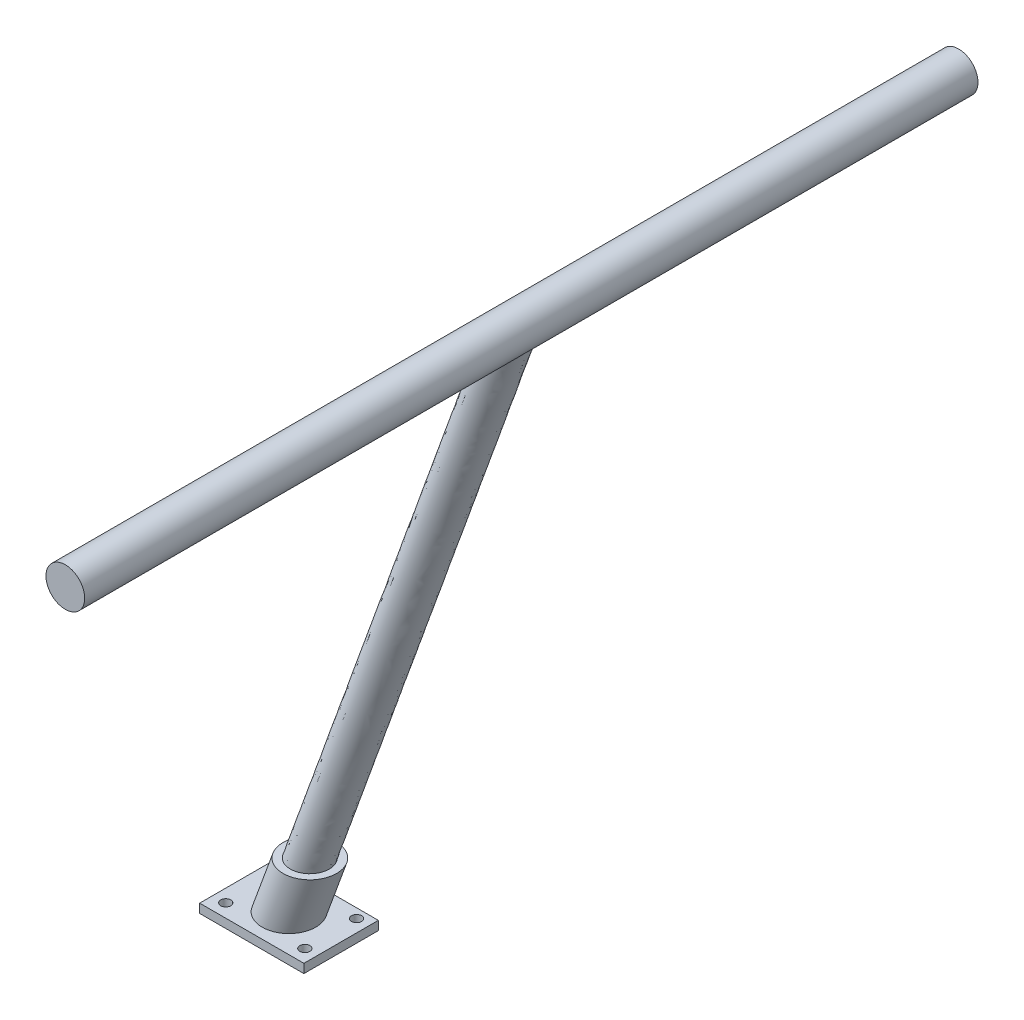
ISO-10303-21;
HEADER;
FILE_DESCRIPTION(('STEP AP214'),'2;1');
FILE_NAME('part.step','',(''),(''),'','','');
FILE_SCHEMA(('AUTOMOTIVE_DESIGN { 1 0 10303 214 1 1 1 1 }'));
ENDSEC;
DATA;
#1=APPLICATION_CONTEXT('core data for automotive mechanical design processes');
#2=APPLICATION_PROTOCOL_DEFINITION('international standard','automotive_design',2000,#1);
#3=PRODUCT_CONTEXT('',#1,'mechanical');
#4=PRODUCT('Part','Part','',(#3));
#5=PRODUCT_RELATED_PRODUCT_CATEGORY('part','',(#4));
#6=PRODUCT_DEFINITION_FORMATION('','',#4);
#7=PRODUCT_DEFINITION_CONTEXT('part definition',#1,'design');
#8=PRODUCT_DEFINITION('design','',#6,#7);
#9=PRODUCT_DEFINITION_SHAPE('','',#8);
#10=(LENGTH_UNIT() NAMED_UNIT(*) SI_UNIT(.MILLI.,.METRE.));
#11=(NAMED_UNIT(*) PLANE_ANGLE_UNIT() SI_UNIT($,.RADIAN.));
#12=(NAMED_UNIT(*) SI_UNIT($,.STERADIAN.) SOLID_ANGLE_UNIT());
#13=UNCERTAINTY_MEASURE_WITH_UNIT(LENGTH_MEASURE(1.E-05),#10,'distance_accuracy_value','');
#14=(GEOMETRIC_REPRESENTATION_CONTEXT(3) GLOBAL_UNCERTAINTY_ASSIGNED_CONTEXT((#13)) GLOBAL_UNIT_ASSIGNED_CONTEXT((#10,
#11,#12)) REPRESENTATION_CONTEXT('',''));
#15=CARTESIAN_POINT('',(0.,0.,0.));
#16=DIRECTION('',(0.,0.,1.));
#17=DIRECTION('',(1.,0.,0.));
#18=AXIS2_PLACEMENT_3D('',#15,#16,#17);
#19=CARTESIAN_POINT('',(0.,3.,6.5));
#20=CARTESIAN_POINT('',(74.8823198165988,209.863815537867,6.5));
#21=CARTESIAN_POINT('',(13.,3.,6.5));
#22=CARTESIAN_POINT('',(87.8823198165988,209.863815537867,6.5));
#23=CARTESIAN_POINT('',(13.,3.,-6.5));
#24=CARTESIAN_POINT('',(87.8823198165988,209.863815537867,-6.5));
#25=CARTESIAN_POINT('',(0.,3.,-6.5));
#26=CARTESIAN_POINT('',(74.8823198165988,209.863815537867,-6.5));
#27=CARTESIAN_POINT('',(-13.,3.,-6.5));
#28=CARTESIAN_POINT('',(61.8823198165988,209.863815537867,-6.5));
#29=CARTESIAN_POINT('',(-13.,3.,6.5));
#30=CARTESIAN_POINT('',(61.8823198165988,209.863815537867,6.5));
#31=CARTESIAN_POINT('',(0.,3.,6.5));
#32=CARTESIAN_POINT('',(74.8823198165988,209.863815537867,6.5));
#33=(BOUNDED_SURFACE() B_SPLINE_SURFACE(3,1,((#19,#20),(#21,#22),(#23,#24),(#25,#26),(#27,#28),
(#29,#30),(#31,#32)),.UNSPECIFIED.,.T.,.F.,.F.) B_SPLINE_SURFACE_WITH_KNOTS((4,3,4),(2,2),(0.,
0.5,1.),(0.,1.),.UNSPECIFIED.) GEOMETRIC_REPRESENTATION_ITEM() RATIONAL_B_SPLINE_SURFACE(((1.,
1.),(0.333333333333333,0.333333333333333),(0.333333333333333,0.333333333333333),(1.,1.),
(0.333333333333333,0.333333333333333),(0.333333333333333,0.333333333333333),(1.,1.))) REPRESENTATION_ITEM('') SURFACE());
#34=CARTESIAN_POINT('',(6.92789586589603,22.1384425052306,6.5));
#35=CARTESIAN_POINT('',(7.10787302393273,22.1384425052306,6.49999806037431));
#36=CARTESIAN_POINT('',(7.28789944726932,22.1384425052306,6.49251775741276));
#37=CARTESIAN_POINT('',(7.64691865661481,22.1384425052306,6.46262416322299));
#38=CARTESIAN_POINT('',(7.82590978129139,22.1384425052306,6.440191339223));
#39=CARTESIAN_POINT('',(8.18373503105978,22.1384425052306,6.38014103722446));
#40=CARTESIAN_POINT('',(8.36253670485913,22.1384425052306,6.34232946245636));
#41=CARTESIAN_POINT('',(8.71638869629833,22.1384425052306,6.25177270310041));
#42=CARTESIAN_POINT('',(8.89143753561501,22.1384425052306,6.19902174575223));
#43=CARTESIAN_POINT('',(9.23662283439896,22.1384425052306,6.07891459175732));
#44=CARTESIAN_POINT('',(9.40675487562154,22.1384425052306,6.01154569515505));
#45=CARTESIAN_POINT('',(9.74079763468615,22.1384425052306,5.86268134780492));
#46=CARTESIAN_POINT('',(9.90470602302412,22.1384425052306,5.78118066986687));
#47=CARTESIAN_POINT('',(10.2249307539887,22.1384425052306,5.60472589803703));
#48=CARTESIAN_POINT('',(10.3812534693084,22.1384425052306,5.50978336883973));
#49=CARTESIAN_POINT('',(10.6854016623214,22.1384425052306,5.30702988800258));
#50=CARTESIAN_POINT('',(10.83322398341,22.1384425052306,5.19921420108145));
#51=CARTESIAN_POINT('',(11.1191645222382,22.1384425052306,4.97158324531647));
#52=CARTESIAN_POINT('',(11.2572889610266,22.1384425052306,4.85177579091581));
#53=CARTESIAN_POINT('',(11.5230066845809,22.1384425052306,4.6009079495255));
#54=CARTESIAN_POINT('',(11.6505960638696,22.1384425052306,4.46984342580904));
#55=CARTESIAN_POINT('',(11.894248400786,22.1384425052306,4.19746625724348));
#56=CARTESIAN_POINT('',(12.010314292436,22.1384425052306,4.05615623696095));
#57=CARTESIAN_POINT('',(12.2301725305776,22.1384425052306,3.76420870764892));
#58=CARTESIAN_POINT('',(12.3339603291228,22.1384425052306,3.61356777362553));
#59=CARTESIAN_POINT('',(12.5284435447691,22.1384425052306,3.30412614541804));
#60=CARTESIAN_POINT('',(12.619143114401,22.1384425052306,3.14532806104866));
#61=CARTESIAN_POINT('',(12.7868755640556,22.1384425052306,2.82059663551728));
#62=CARTESIAN_POINT('',(12.8639033856301,22.1384425052306,2.65466068148868));
#63=CARTESIAN_POINT('',(13.0036759041341,22.1384425052306,2.31695471668466));
#64=CARTESIAN_POINT('',(13.0664261840889,22.1384425052306,2.14518701662892));
#65=CARTESIAN_POINT('',(13.177256849986,22.1384425052306,1.79691256199059));
#66=CARTESIAN_POINT('',(13.2253318113881,22.1384425052306,1.62040408120579));
#67=CARTESIAN_POINT('',(13.3064229807721,22.1384425052306,1.26403009178918));
#68=CARTESIAN_POINT('',(13.3394448276958,22.1384425052306,1.08416586655533));
#69=CARTESIAN_POINT('',(13.3902323922716,22.1384425052306,0.722231776888186));
#70=CARTESIAN_POINT('',(13.407992472883,22.1384425052306,0.540161122653113));
#71=CARTESIAN_POINT('',(13.4281006067863,22.1384425052306,0.175224742477707));
#72=CARTESIAN_POINT('',(13.4304542951375,22.1384425052306,-0.00764066827970122));
#73=CARTESIAN_POINT('',(13.419765437547,22.1384425052306,-0.372939116940066));
#74=CARTESIAN_POINT('',(13.4067172069706,22.1384425052306,-0.55537197028394));
#75=CARTESIAN_POINT('',(13.34453838565,22.1384425052306,-1.09992879763092));
#76=CARTESIAN_POINT('',(13.2723951782202,22.1384425052306,-1.45970800716479));
#77=CARTESIAN_POINT('',(13.0687607446411,22.1384425052306,-2.16184980907283));
#78=CARTESIAN_POINT('',(12.9372695205312,22.1384425052306,-2.50421240204556));
#79=CARTESIAN_POINT('',(12.6186675373144,22.1384425052306,-3.16205615402645));
#80=CARTESIAN_POINT('',(12.4315567348838,22.1384425052306,-3.47753729209568));
#81=CARTESIAN_POINT('',(12.0070282909133,22.1384425052306,-4.07259423631814));
#82=CARTESIAN_POINT('',(11.7696106603194,22.1384425052306,-4.3521700502839));
#83=CARTESIAN_POINT('',(11.2512079259835,22.1384425052306,-4.86749820605125));
#84=CARTESIAN_POINT('',(10.9702228372179,22.1384425052306,-5.10325056291726));
#85=CARTESIAN_POINT('',(10.3726615093251,22.1384425052306,-5.52423475479281));
#86=CARTESIAN_POINT('',(10.056085266249,22.1384425052306,-5.70946658419713));
#87=CARTESIAN_POINT('',(9.39632826159159,22.1384425052306,-6.02415282638959));
#88=CARTESIAN_POINT('',(9.05314749676842,22.1384425052306,-6.15360723238105));
#89=CARTESIAN_POINT('',(8.34992339435535,22.1384425052306,-6.35306341035082));
#90=CARTESIAN_POINT('',(7.98988005734655,22.1384425052306,-6.42306518437785));
#91=CARTESIAN_POINT('',(7.26315138944631,22.1384425052306,-6.50162905490163));
#92=CARTESIAN_POINT('',(6.89646605890648,22.1384425052306,-6.51019115465071));
#93=CARTESIAN_POINT('',(6.16686250852888,22.1384425052306,-6.46563260082384));
#94=CARTESIAN_POINT('',(5.80394428864819,22.1384425052306,-6.41251194795062));
#95=CARTESIAN_POINT('',(5.09217710599249,22.1384425052306,-6.24609585447203));
#96=CARTESIAN_POINT('',(4.74332814428282,22.1384425052306,-6.13280040931017));
#97=CARTESIAN_POINT('',(4.06960229010161,22.1384425052306,-5.84925074794618));
#98=CARTESIAN_POINT('',(3.74472539933672,22.1384425052306,-5.678996527689));
#99=CARTESIAN_POINT('',(3.12816604666716,22.1384425052306,-5.28636272768447));
#100=CARTESIAN_POINT('',(2.83648357752264,22.1384425052306,-5.06398315930593));
#101=CARTESIAN_POINT('',(2.2945931815615,22.1384425052306,-4.57341009016808));
#102=CARTESIAN_POINT('',(2.04438524694055,22.1384425052306,-4.30521659802967));
#103=CARTESIAN_POINT('',(1.59254586538815,22.1384425052306,-3.73063355243368));
#104=CARTESIAN_POINT('',(1.390914447333,22.1384425052306,-3.42424397627062));
#105=CARTESIAN_POINT('',(1.04195389510686,22.1384425052306,-2.78194819292401));
#106=CARTESIAN_POINT('',(0.894624776722688,22.1384425052306,-2.4460419771594));
#107=CARTESIAN_POINT('',(0.658444096589992,22.1384425052306,-1.75431637273248));
#108=CARTESIAN_POINT('',(0.569592466078452,22.1384425052306,-1.39849700748635));
#109=CARTESIAN_POINT('',(0.452915532967883,22.1384425052306,-0.676793004683516));
#110=CARTESIAN_POINT('',(0.425090266003319,22.1384425052306,-0.310908361249619));
#111=CARTESIAN_POINT('',(0.429641076442871,22.1384425052306,0.237168006101527));
#112=CARTESIAN_POINT('',(0.438890202126675,22.1384425052306,0.419832815036486));
#113=CARTESIAN_POINT('',(0.472734198698052,22.1384425052306,0.783716997482473));
#114=CARTESIAN_POINT('',(0.497323404713403,22.1384425052306,0.964936879575524));
#115=CARTESIAN_POINT('',(0.561691272009632,22.1384425052306,1.32471309810583));
#116=CARTESIAN_POINT('',(0.601475413733635,22.1384425052306,1.50326844933952));
#117=CARTESIAN_POINT('',(0.695928881552405,22.1384425052306,1.85633048557793));
#118=CARTESIAN_POINT('',(0.750592708740308,22.1384425052306,2.03083864045323));
#119=CARTESIAN_POINT('',(0.87444830284147,22.1384425052306,2.3746961541715));
#120=CARTESIAN_POINT('',(0.943645662750788,22.1384425052306,2.54404349814605));
#121=CARTESIAN_POINT('',(1.09603505071561,22.1384425052306,2.87624435468357));
#122=CARTESIAN_POINT('',(1.17922190473826,22.1384425052306,3.03910024067404));
#123=CARTESIAN_POINT('',(1.35905467090869,22.1384425052306,3.35729332885904));
#124=CARTESIAN_POINT('',(1.45570620370471,22.1384425052306,3.51262735447385));
#125=CARTESIAN_POINT('',(1.66171629292924,22.1384425052306,3.81454305257729));
#126=CARTESIAN_POINT('',(1.77107014576472,22.1384425052306,3.96112793457554));
#127=CARTESIAN_POINT('',(2.00176567150413,22.1384425052306,4.24460177272211));
#128=CARTESIAN_POINT('',(2.12311038211381,22.1384425052306,4.3814882567673));
#129=CARTESIAN_POINT('',(2.37685451674287,22.1384425052306,4.64450223052314));
#130=CARTESIAN_POINT('',(2.5092498429251,22.1384425052306,4.77063367369683));
#131=CARTESIAN_POINT('',(2.78421169742256,22.1384425052306,5.01131407167941));
#132=CARTESIAN_POINT('',(2.92677959230627,22.1384425052306,5.12586146528815));
#133=CARTESIAN_POINT('',(3.22100302580611,22.1384425052306,5.34250017863424));
#134=CARTESIAN_POINT('',(3.37265519344747,22.1384425052306,5.44459607667323));
#135=CARTESIAN_POINT('',(3.68416630770629,22.1384425052306,5.63574705127996));
#136=CARTESIAN_POINT('',(3.84403294277952,22.1384425052306,5.7247895986494));
#137=CARTESIAN_POINT('',(4.17064178797332,22.1384425052306,5.88905352862092));
#138=CARTESIAN_POINT('',(4.33738143827622,22.1384425052306,5.96428000100252));
#139=CARTESIAN_POINT('',(4.67683237067498,22.1384425052306,6.10050857064698));
#140=CARTESIAN_POINT('',(4.84955133992181,22.1384425052306,6.16149151247717));
#141=CARTESIAN_POINT('',(5.19945372988802,22.1384425052306,6.2686482822626));
#142=CARTESIAN_POINT('',(5.37663542879314,22.1384425052306,6.31482773010249));
#143=CARTESIAN_POINT('',(5.73389053570221,22.1384425052306,6.39200177136501));
#144=CARTESIAN_POINT('',(5.91395732754271,22.1384425052306,6.42302706553695));
#145=CARTESIAN_POINT('',(6.27598857765646,22.1384425052306,6.46979875777846));
#146=CARTESIAN_POINT('',(6.45795190704311,22.1384425052306,6.4855537728847));
#147=CARTESIAN_POINT('',(6.73604332106764,22.1384425052306,6.49787730577093));
#148=CARTESIAN_POINT('',(6.83196259482238,22.1384425052306,6.50000103387918));
#149=CARTESIAN_POINT('',(6.92789586589603,22.1384425052306,6.5));
#150=B_SPLINE_CURVE_WITH_KNOTS('',3,(#34,#35,#36,#37,#38,#39,#40,#41,#42,#43,#44,#45,#46,#47,
#48,#49,#50,#51,#52,#53,#54,#55,#56,#57,#58,#59,#60,#61,#62,#63,#64,#65,#66,#67,#68,#69,#70,#71,
#72,#73,#74,#75,#76,#77,#78,#79,#80,#81,#82,#83,#84,#85,#86,#87,#88,#89,#90,#91,#92,#93,#94,#95,
#96,#97,#98,#99,#100,#101,#102,#103,#104,#105,#106,#107,#108,#109,#110,#111,#112,#113,#114,#115,
#116,#117,#118,#119,#120,#121,#122,#123,#124,#125,#126,#127,#128,#129,#130,#131,#132,#133,#134,
#135,#136,#137,#138,#139,#140,#141,#142,#143,#144,#145,#146,#147,#148,#149),.UNSPECIFIED.,.T.,
.F.,(4,2,2,2,2,2,2,2,2,2,2,2,2,2,2,2,2,2,2,2,2,2,2,2,2,2,2,2,2,2,2,2,2,2,2,2,2,2,2,2,2,2,2,2,2,
2,2,2,2,2,2,2,2,2,2,2,2,4),(0.,0.539861496346598,1.08042961012388,1.62804315521273,
2.17586859427601,2.72417189935213,3.27267845011471,3.82071592912142,4.36895562371845,
4.91684035517577,5.46492729083253,6.01287431696654,6.56102367762992,7.10899874156632,
7.65717613158798,8.20513879498614,8.75330376105564,9.30126321380239,9.8494249723433,
10.3973862234188,10.9455497826465,12.040699282472,13.1358487446611,14.2309990598942,
15.3261491368365,16.4212988373175,17.5164486593046,18.6115986147398,19.7067485324365,
20.801898392161,21.8970482394089,22.9921981695823,24.0873481777225,25.1824979470053,
26.2776475102119,27.3727977244284,28.467948257028,29.5630975018501,30.6582473861507,
31.2064107531309,31.75437181095,32.3025306918942,32.8504872707217,33.398655109465,
33.9466206517056,34.4948156240109,35.0428082462556,35.590940051945,36.1388694924565,
36.6868726801239,37.2346737606021,37.7829972502541,38.3311183330454,38.8799723665978,
39.4286177899874,39.976147056144,40.5233671706845,40.81112968364),.UNSPECIFIED.);
#151=CARTESIAN_POINT('',(6.96624783708179,22.1384425052306,-6.49988685488495));
#152=VERTEX_POINT('',#151);
#153=CARTESIAN_POINT('',(6.96624783708174,22.1384425052306,6.49988685488495));
#154=VERTEX_POINT('',#153);
#155=EDGE_CURVE('E152',#152,#154,#150,.T.);
#156=CARTESIAN_POINT('',(6.96624783708178,22.1384425052306,6.49988685488495));
#157=CARTESIAN_POINT('',(6.31270813397352,20.3429663284858,6.49990808451742));
#158=CARTESIAN_POINT('',(5.65916843085729,18.5474901517099,6.4999263265686));
#159=CARTESIAN_POINT('',(4.35208902460854,14.9565377981132,6.49995683562296));
#160=CARTESIAN_POINT('',(3.69854932147602,13.1610616212924,6.49996910262614));
#161=CARTESIAN_POINT('',(2.0647101343125,8.67239884650976,6.49999230132431));
#162=CARTESIAN_POINT('',(1.08441065027109,5.97921224853069,6.49999949882401));
#163=CARTESIAN_POINT('',(0.0694074441676104,3.19068376703227,6.4999999915762));
#164=CARTESIAN_POINT('',(0.0347037220839475,3.09534188351657,6.49999999999999));
#165=CARTESIAN_POINT('',(3.13552053849428E-13,3.00000000000086,6.5));
#166=B_SPLINE_CURVE_WITH_KNOTS('',3,(#156,#157,#158,#159,#160,#161,#162,#163,#164,#165),
.UNSPECIFIED.,.F.,.F.,(4,2,2,2,4),(0.,5.73215837247843,11.4643167449569,20.0624659742562,
20.3668502834922),.UNSPECIFIED.);
#167=CARTESIAN_POINT('',(0.,3.,6.5));
#168=VERTEX_POINT('',#167);
#169=EDGE_CURVE('E61',#154,#168,#166,.T.);
#170=CARTESIAN_POINT('',(0.,3.,0.));
#171=DIRECTION('',(0.,1.,0.));
#172=DIRECTION('',(0.,0.,1.));
#173=AXIS2_PLACEMENT_3D('',#170,#171,#172);
#174=CIRCLE('',#173,6.5);
#175=CARTESIAN_POINT('',(-1.62281149593456E-13,3.,-6.5));
#176=VERTEX_POINT('',#175);
#177=EDGE_CURVE('E141',#168,#176,#174,.T.);
#178=CARTESIAN_POINT('',(6.96624783708179,22.1384425052306,-6.49988685488495));
#179=CARTESIAN_POINT('',(6.31270813397935,20.3429663284837,-6.49990808451742));
#180=CARTESIAN_POINT('',(5.65916843086012,18.5474901517088,-6.4999263265686));
#181=CARTESIAN_POINT('',(4.35208902460538,14.9565377981143,-6.49995683562296));
#182=CARTESIAN_POINT('',(3.69854932146986,13.1610616212947,-6.49996910262615));
#183=CARTESIAN_POINT('',(2.06471013432065,8.67239884650632,-6.49999230132431));
#184=CARTESIAN_POINT('',(1.08441065030757,5.97921224851643,-6.499999498824));
#185=CARTESIAN_POINT('',(0.0694074441697111,3.19068376703003,-6.4999999915762));
#186=CARTESIAN_POINT('',(0.0347037220848003,3.09534188351478,-6.49999999999999));
#187=CARTESIAN_POINT('',(-1.62281149593456E-13,2.99999999999956,-6.5));
#188=B_SPLINE_CURVE_WITH_KNOTS('',3,(#178,#179,#180,#181,#182,#183,#184,#185,#186,#187),
.UNSPECIFIED.,.F.,.F.,(4,2,2,2,4),(0.,5.73215837247843,11.4643167449569,20.0624659742576,
20.3668502834936),.UNSPECIFIED.);
#189=EDGE_CURVE('E144',#176,#152,#188,.F.);
#190=CARTESIAN_POINT('',(72.6698876401993,203.751930078794,6.5));
#191=CARTESIAN_POINT('',(72.5429335764988,203.797885681788,6.50000031084754));
#192=CARTESIAN_POINT('',(72.4174176538613,203.847803920402,6.49523333605837));
#193=CARTESIAN_POINT('',(72.1703412742477,203.955066941168,6.47627242483975));
#194=CARTESIAN_POINT('',(72.0487807141633,204.012411529536,6.46207873435247));
#195=CARTESIAN_POINT('',(71.8105180966882,204.133900546337,6.42456184335136));
#196=CARTESIAN_POINT('',(71.6938179033036,204.19804755073,6.40123517526512));
#197=CARTESIAN_POINT('',(71.4660906714856,204.332372816691,6.34592146661731));
#198=CARTESIAN_POINT('',(71.3550638094058,204.402551265562,6.31393415703706));
#199=CARTESIAN_POINT('',(71.139993518994,204.547641621636,6.24212943200234));
#200=CARTESIAN_POINT('',(71.0359074008345,204.622517746031,6.20236724903254));
#201=CARTESIAN_POINT('',(70.8342292153502,204.776666102473,6.11550423391185));
#202=CARTESIAN_POINT('',(70.7366395642854,204.855939950308,6.06840069278098));
#203=CARTESIAN_POINT('',(70.4540349640781,205.099153251037,5.91709934627335));
#204=CARTESIAN_POINT('',(70.2790402194197,205.268583275149,5.80286119411109));
#205=CARTESIAN_POINT('',(69.884271238529,205.69402305206,5.49703433830784));
#206=CARTESIAN_POINT('',(69.679109873074,205.955075063345,5.2936218325929));
#207=CARTESIAN_POINT('',(69.4104189941387,206.351833701535,4.96348027840498));
#208=CARTESIAN_POINT('',(69.3272385030841,206.485218571391,4.84901168082575));
#209=CARTESIAN_POINT('',(69.1731940917123,206.752602044734,4.61266382835657));
#210=CARTESIAN_POINT('',(69.102329288563,206.886600603523,4.49078510549684));
#211=CARTESIAN_POINT('',(68.9790083599278,207.140092613573,4.25353090882118));
#212=CARTESIAN_POINT('',(68.9254031279511,207.259641306882,4.13880291632369));
#213=CARTESIAN_POINT('',(68.8269455266724,207.497590846944,3.90441335985661));
#214=CARTESIAN_POINT('',(68.7820963285529,207.615991263125,3.78475002738429));
#215=CARTESIAN_POINT('',(68.7006235801698,207.850836146098,3.54067810024681));
#216=CARTESIAN_POINT('',(68.6640043410532,207.967279558331,3.41626705829152));
#217=CARTESIAN_POINT('',(68.5985395522486,208.196982018319,3.16299113977283));
#218=CARTESIAN_POINT('',(68.5696796983127,208.310246576012,3.03413495964972));
#219=CARTESIAN_POINT('',(68.5190916368417,208.532533914945,2.771570553753));
#220=CARTESIAN_POINT('',(68.4973598774582,208.641558784828,2.63786478147596));
#221=CARTESIAN_POINT('',(68.4603946313127,208.853653543464,2.36507363416326));
#222=CARTESIAN_POINT('',(68.4451557439567,208.956728319399,2.22599283537851));
#223=CARTESIAN_POINT('',(68.4259079844927,209.110286266476,2.00486254279942));
#224=CARTESIAN_POINT('',(68.4199214544658,209.163727563425,1.92503312729192));
#225=CARTESIAN_POINT('',(68.4095367486021,209.267338292246,1.76316960777153));
#226=CARTESIAN_POINT('',(68.4051385330981,209.317507805804,1.68113555887286));
#227=CARTESIAN_POINT('',(68.397742126037,209.413727616168,1.5146277861376));
#228=CARTESIAN_POINT('',(68.3947435520351,209.459779035438,1.43015473545236));
#229=CARTESIAN_POINT('',(68.389916232371,209.546656418775,1.25856106721886));
#230=CARTESIAN_POINT('',(68.3880873167285,209.587483141428,1.17144083629983));
#231=CARTESIAN_POINT('',(68.3844823488095,209.685568178889,0.939907347272217));
#232=CARTESIAN_POINT('',(68.383425487314,209.737564443545,0.793100531144543));
#233=CARTESIAN_POINT('',(68.3826312095039,209.79712706018,0.568276335736433));
#234=CARTESIAN_POINT('',(68.3824979379148,209.813899126614,0.492670173435309));
#235=CARTESIAN_POINT('',(68.3823478636128,209.840517648415,0.34022723767336));
#236=CARTESIAN_POINT('',(68.3823310471065,209.850364923855,0.263390611033691));
#237=CARTESIAN_POINT('',(68.3823168542638,209.862602648167,0.108356318139474));
#238=CARTESIAN_POINT('',(68.3823196706994,209.864918825503,0.0301526978839991));
#239=CARTESIAN_POINT('',(68.3823199992787,209.861734351092,-0.126092913477703));
#240=CARTESIAN_POINT('',(68.3823175113845,209.856233643436,-0.204134903423897));
#241=CARTESIAN_POINT('',(68.3823656702191,209.837748554314,-0.359492669586468));
#242=CARTESIAN_POINT('',(68.3824164379059,209.824747166997,-0.436806388451176));
#243=CARTESIAN_POINT('',(68.3826961337015,209.79199579375,-0.589981184743965));
#244=CARTESIAN_POINT('',(68.3829251013442,209.772244310846,-0.665841936002113));
#245=CARTESIAN_POINT('',(68.3838818481435,209.717846672037,-0.845829051298047));
#246=CARTESIAN_POINT('',(68.3847726930037,209.680403395788,-0.949105838366202));
#247=CARTESIAN_POINT('',(68.3876775523536,209.596655925312,-1.15196802550186));
#248=CARTESIAN_POINT('',(68.3896922464721,209.550346380501,-1.25155115299127));
#249=CARTESIAN_POINT('',(68.3952621055554,209.450806866795,-1.44758217527686));
#250=CARTESIAN_POINT('',(68.3988229973576,209.397551690611,-1.54401696750651));
#251=CARTESIAN_POINT('',(68.4078237070376,209.285847956514,-1.73375236185638));
#252=CARTESIAN_POINT('',(68.4132641784605,209.227397597451,-1.82705186141205));
#253=CARTESIAN_POINT('',(68.4292397747989,209.079265886128,-2.05229575499988));
#254=CARTESIAN_POINT('',(68.440965935622,208.987381910926,-2.18270514260823));
#255=CARTESIAN_POINT('',(68.4696318150209,208.797671671464,-2.43863830740439));
#256=CARTESIAN_POINT('',(68.4865754994141,208.699840932649,-2.56415828613829));
#257=CARTESIAN_POINT('',(68.526216159047,208.499871387706,-2.81086398798237));
#258=CARTESIAN_POINT('',(68.548915622588,208.397730734304,-2.93204781059147));
#259=CARTESIAN_POINT('',(68.6005277451803,208.19034254076,-3.17034186142221));
#260=CARTESIAN_POINT('',(68.6294398732342,208.085095266805,-3.28745243679161));
#261=CARTESIAN_POINT('',(68.6938950461744,207.872398275578,-3.51768206632531));
#262=CARTESIAN_POINT('',(68.7294348912575,207.764949643293,-3.63080301543866));
#263=CARTESIAN_POINT('',(68.8075589175235,207.548536261454,-3.85303692937912));
#264=CARTESIAN_POINT('',(68.8501416217041,207.439571834167,-3.96215072871992));
#265=CARTESIAN_POINT('',(68.9552550591758,207.191243950283,-4.20505315289608));
#266=CARTESIAN_POINT('',(69.0200700385315,207.051592180297,-4.33757859790722));
#267=CARTESIAN_POINT('',(69.1625519865355,206.772068355809,-4.59521725475918));
#268=CARTESIAN_POINT('',(69.240220409239,206.63219627816,-4.72032962581339));
#269=CARTESIAN_POINT('',(69.493518834466,206.214632019702,-5.08266480532907));
#270=CARTESIAN_POINT('',(69.689788314336,205.938133216657,-5.30772163671745));
#271=CARTESIAN_POINT('',(70.0819086468992,205.473845508268,-5.65820589022221));
#272=CARTESIAN_POINT('',(70.2636905107592,205.282189583527,-5.7941524919328));
#273=CARTESIAN_POINT('',(70.5610546779848,205.00634818597,-5.97517124481845));
#274=CARTESIAN_POINT('',(70.6643310299278,204.916312534534,-6.03170945781092));
#275=CARTESIAN_POINT('',(70.8789577205987,204.741095620026,-6.13627320120403));
#276=CARTESIAN_POINT('',(70.9903044037273,204.655912189898,-6.18430255230488));
#277=CARTESIAN_POINT('',(71.2219532434721,204.490531402248,-6.27145396667339));
#278=CARTESIAN_POINT('',(71.3423378727754,204.410396525563,-6.3104761324453));
#279=CARTESIAN_POINT('',(71.5903430980301,204.25720105857,-6.3781177390729));
#280=CARTESIAN_POINT('',(71.71796371761,204.184140491365,-6.40673714595686));
#281=CARTESIAN_POINT('',(71.9793361408313,204.046213163937,-6.45285969699107));
#282=CARTESIAN_POINT('',(72.1130817140472,203.981338318734,-6.47037387963682));
#283=CARTESIAN_POINT('',(72.3855599672164,203.860617951833,-6.49387034247918));
#284=CARTESIAN_POINT('',(72.5242917874624,203.804770882648,-6.49985460099179));
#285=CARTESIAN_POINT('',(72.783776216759,203.710592328494,-6.50011841286453));
#286=CARTESIAN_POINT('',(72.9040342943402,203.670888322384,-6.4960478034675));
#287=CARTESIAN_POINT('',(73.1461402185998,203.598703225774,-6.4796084089034));
#288=CARTESIAN_POINT('',(73.2679880283653,203.56622196788,-6.46723981607724));
#289=CARTESIAN_POINT('',(73.5123245236821,203.508591561043,-6.43443727164918));
#290=CARTESIAN_POINT('',(73.6348132265526,203.483442611296,-6.41400310096579));
#291=CARTESIAN_POINT('',(73.8795377617296,203.440431163753,-6.36543525951324));
#292=CARTESIAN_POINT('',(74.0017735830687,203.422568975652,-6.3373012615765));
#293=CARTESIAN_POINT('',(74.2428706091326,203.394228689114,-6.27439784802012));
#294=CARTESIAN_POINT('',(74.3617517933926,203.383616682953,-6.23976472866674));
#295=CARTESIAN_POINT('',(74.5978493557408,203.368964757033,-6.16402693121931));
#296=CARTESIAN_POINT('',(74.7150652488158,203.36492671455,-6.12292040823953));
#297=CARTESIAN_POINT('',(75.0633539782627,203.362197153208,-5.99065676205632));
#298=CARTESIAN_POINT('',(75.2912016213338,203.372875299334,-5.89051989519547));
#299=CARTESIAN_POINT('',(75.6795171587006,203.410708007123,-5.6979080342783));
#300=CARTESIAN_POINT('',(75.8426664880514,203.433112426909,-5.60970569458603));
#301=CARTESIAN_POINT('',(76.1614483739993,203.488865573272,-5.42364055261315));
#302=CARTESIAN_POINT('',(76.3170798339785,203.52221589101,-5.32577634727289));
#303=CARTESIAN_POINT('',(76.6206776328842,203.598618467623,-5.12144856350373));
#304=CARTESIAN_POINT('',(76.7686222062812,203.641696606004,-5.01496254174861));
#305=CARTESIAN_POINT('',(77.0561235203761,203.736216314644,-4.79470176120586));
#306=CARTESIAN_POINT('',(77.1956806220869,203.787657524587,-4.68092731656207));
#307=CARTESIAN_POINT('',(77.5161521194581,203.917986264677,-4.40378610902414));
#308=CARTESIAN_POINT('',(77.6933566306613,204.000002569657,-4.23759386047851));
#309=CARTESIAN_POINT('',(78.0316406803641,204.174527782389,-3.89448865507092));
#310=CARTESIAN_POINT('',(78.1927105990857,204.267042880458,-3.7175694022624));
#311=CARTESIAN_POINT('',(78.4217643056949,204.411249405832,-3.44473892124429));
#312=CARTESIAN_POINT('',(78.4960096853336,204.460213254952,-3.35257323446044));
#313=CARTESIAN_POINT('',(78.6402539336389,204.559516074216,-3.16569870929276));
#314=CARTESIAN_POINT('',(78.7102531774881,204.609854922296,-3.07099009666817));
#315=CARTESIAN_POINT('',(78.8458314355338,204.711365382707,-2.87899551912367));
#316=CARTESIAN_POINT('',(78.9114130700319,204.762536478625,-2.78171113059202));
#317=CARTESIAN_POINT('',(79.037989932744,204.865111993691,-2.58433854465892));
#318=CARTESIAN_POINT('',(79.0989858322077,204.916516377517,-2.48425076056778));
#319=CARTESIAN_POINT('',(79.2101864028991,205.013613800206,-2.29121319926441));
#320=CARTESIAN_POINT('',(79.2608591240849,205.059360400573,-2.19856042010936));
#321=CARTESIAN_POINT('',(79.3579147322818,205.149641196188,-2.01044117663006));
#322=CARTESIAN_POINT('',(79.4042975179178,205.194175362767,-1.91497464588446));
#323=CARTESIAN_POINT('',(79.4922496103855,205.280982232627,-1.72092096642524));
#324=CARTESIAN_POINT('',(79.5338221141315,205.323256427715,-1.62233594639296));
#325=CARTESIAN_POINT('',(79.6114709704553,205.40418904836,-1.42156937478671));
#326=CARTESIAN_POINT('',(79.6475490630681,205.442848617135,-1.31938897451277));
#327=CARTESIAN_POINT('',(79.7030131691905,205.503534812198,-1.14337891673851));
#328=CARTESIAN_POINT('',(79.7241056275465,205.527001180454,-1.07058619691722));
#329=CARTESIAN_POINT('',(79.7627701675568,205.570558979243,-0.923045634627499));
#330=CARTESIAN_POINT('',(79.7803416793325,205.590649863356,-0.848297477873999));
#331=CARTESIAN_POINT('',(79.8114243133216,205.626541299739,-0.697180475616992));
#332=CARTESIAN_POINT('',(79.8249477932381,205.642354895032,-0.620817340613328));
#333=CARTESIAN_POINT('',(79.8475051420708,205.668909055689,-0.466587960374366));
#334=CARTESIAN_POINT('',(79.8565418221226,205.679652797281,-0.388722688133804));
#335=CARTESIAN_POINT('',(79.8698165900304,205.695484095953,-0.23088953211292));
#336=CARTESIAN_POINT('',(79.8739859838457,205.700490664254,-0.150907469610848));
#337=CARTESIAN_POINT('',(79.8770708588056,205.704191936412,0.00930216604456307));
#338=CARTESIAN_POINT('',(79.8759867236929,205.702887101283,0.0895297208381687));
#339=CARTESIAN_POINT('',(79.8686201927783,205.694062548549,0.249514501211928));
#340=CARTESIAN_POINT('',(79.8623298974122,205.686533386486,0.329270826435953));
#341=CARTESIAN_POINT('',(79.8448657598996,205.665801891136,0.487495057771882));
#342=CARTESIAN_POINT('',(79.8336906823633,205.652598122723,0.56596263273919));
#343=CARTESIAN_POINT('',(79.8032554819649,205.617042974611,0.742496186266052));
#344=CARTESIAN_POINT('',(79.7826168911713,205.593174346484,0.840015235153587));
#345=CARTESIAN_POINT('',(79.7352512908445,205.5394271848,1.03184486061081));
#346=CARTESIAN_POINT('',(79.7085214290961,205.509545836577,1.12615391025712));
#347=CARTESIAN_POINT('',(79.6497983496315,205.445326192707,1.31198467985553));
#348=CARTESIAN_POINT('',(79.6177844962332,205.410970539071,1.40349373457433));
#349=CARTESIAN_POINT('',(79.5493047419293,205.339247689668,1.58357869197508));
#350=CARTESIAN_POINT('',(79.5128392179798,205.301880748979,1.67215484220154));
#351=CARTESIAN_POINT('',(79.4185096775035,205.207722286646,1.88642154865043));
#352=CARTESIAN_POINT('',(79.3584585541441,205.149828387682,2.01066193232021));
#353=CARTESIAN_POINT('',(79.2311457659506,205.032123125721,2.25454636522431));
#354=CARTESIAN_POINT('',(79.1638784099815,204.972310275776,2.37418668406755));
#355=CARTESIAN_POINT('',(79.0228053268516,204.852332709479,2.60943355115499));
#356=CARTESIAN_POINT('',(78.9489969441618,204.792167859567,2.72503843429683));
#357=CARTESIAN_POINT('',(78.7951563872645,204.672551291081,2.95272875826267));
#358=CARTESIAN_POINT('',(78.7151143091168,204.613100887967,3.06480818437012));
#359=CARTESIAN_POINT('',(78.54920254708,204.495921919643,3.28540503780782));
#360=CARTESIAN_POINT('',(78.4633356594956,204.438192547116,3.39392413772985));
#361=CARTESIAN_POINT('',(78.2859058283563,204.325163042678,3.60749627924789));
#362=CARTESIAN_POINT('',(78.1943430917988,204.269862822611,3.71254944658999));
#363=CARTESIAN_POINT('',(77.9435416508727,204.126976714045,3.98708306747821));
#364=CARTESIAN_POINT('',(77.7793835524897,204.042065343754,4.15351713406266));
#365=CARTESIAN_POINT('',(77.4358592206115,203.8834080717,4.47586407343314));
#366=CARTESIAN_POINT('',(77.2564871408466,203.809666492747,4.63177285996612));
#367=CARTESIAN_POINT('',(76.8835480926531,203.676399562466,4.93075895813758));
#368=CARTESIAN_POINT('',(76.6900399458808,203.616819248469,5.07388448675457));
#369=CARTESIAN_POINT('',(76.2889226605111,203.514458077459,5.34552153488056));
#370=CARTESIAN_POINT('',(76.0813198285695,203.471669764235,5.47403952257745));
#371=CARTESIAN_POINT('',(75.6190200872744,203.400838326363,5.73243162572048));
#372=CARTESIAN_POINT('',(75.3620605651581,203.37618645706,5.8593209204762));
#373=CARTESIAN_POINT('',(74.966564492913,203.363018774589,6.0273505346052));
#374=CARTESIAN_POINT('',(74.833033806033,203.362599769658,6.07964970761507));
#375=CARTESIAN_POINT('',(74.5632955690378,203.370249754349,6.17604814439102));
#376=CARTESIAN_POINT('',(74.4270891608955,203.378315196935,6.22015082574182));
#377=CARTESIAN_POINT('',(74.1553975352915,203.403176661816,6.29865848154753));
#378=CARTESIAN_POINT('',(74.0199446002014,203.419810497395,6.3332259001517));
#379=CARTESIAN_POINT('',(73.7483610984555,203.462017729848,6.39304152565938));
#380=CARTESIAN_POINT('',(73.6122305569421,203.487590797437,6.41829007576036));
#381=CARTESIAN_POINT('',(73.3405656126378,203.547777424725,6.45891082764462));
#382=CARTESIAN_POINT('',(73.2050309182298,203.582385904118,6.4742885627002));
#383=CARTESIAN_POINT('',(72.9357738812469,203.660541687021,6.49483277296993));
#384=CARTESIAN_POINT('',(72.8020514629041,203.704088615595,6.49999967639634));
#385=CARTESIAN_POINT('',(72.6698876401993,203.751930078794,6.5));
#386=B_SPLINE_CURVE_WITH_KNOTS('',3,(#190,#191,#192,#193,#194,#195,#196,#197,#198,#199,#200,
#201,#202,#203,#204,#205,#206,#207,#208,#209,#210,#211,#212,#213,#214,#215,#216,#217,#218,#219,
#220,#221,#222,#223,#224,#225,#226,#227,#228,#229,#230,#231,#232,#233,#234,#235,#236,#237,#238,
#239,#240,#241,#242,#243,#244,#245,#246,#247,#248,#249,#250,#251,#252,#253,#254,#255,#256,#257,
#258,#259,#260,#261,#262,#263,#264,#265,#266,#267,#268,#269,#270,#271,#272,#273,#274,#275,#276,
#277,#278,#279,#280,#281,#282,#283,#284,#285,#286,#287,#288,#289,#290,#291,#292,#293,#294,#295,
#296,#297,#298,#299,#300,#301,#302,#303,#304,#305,#306,#307,#308,#309,#310,#311,#312,#313,#314,
#315,#316,#317,#318,#319,#320,#321,#322,#323,#324,#325,#326,#327,#328,#329,#330,#331,#332,#333,
#334,#335,#336,#337,#338,#339,#340,#341,#342,#343,#344,#345,#346,#347,#348,#349,#350,#351,#352,
#353,#354,#355,#356,#357,#358,#359,#360,#361,#362,#363,#364,#365,#366,#367,#368,#369,#370,#371,
#372,#373,#374,#375,#376,#377,#378,#379,#380,#381,#382,#383,#384,#385),.UNSPECIFIED.,.T.,.F.,(4,
2,2,2,2,2,2,2,2,2,2,2,2,2,2,2,2,2,2,2,2,2,2,2,2,2,2,2,2,2,2,2,2,2,2,2,2,2,2,2,2,2,2,2,2,2,2,2,2,
2,2,2,2,2,2,2,2,2,2,2,2,2,2,2,2,2,2,2,2,2,2,2,2,2,2,2,2,2,2,2,2,2,2,2,2,2,2,2,2,2,2,2,2,2,2,2,2,
4),(0.,0.404893077013033,0.809775590817336,1.21481197810093,1.6198609481545,2.02213066270688,
2.42454916879907,3.22884718962863,4.39023317948925,4.97323328947378,5.55619159068738,
6.07834999932801,6.60069716926244,7.1233173288456,7.64496733955255,8.16635702171874,
8.68731217550022,8.97599406655623,9.26466874747594,9.55326450329878,9.84181830948706,
10.3071972197295,10.5392664829685,10.7713082586295,11.0056315933653,11.2399566040698,
11.4748149857279,11.7097254859201,12.0387311667594,12.3679360242342,12.6983707389659,
13.0289204643565,13.5084510402134,13.988347008687,14.4684507974742,14.9485135680282,
15.4283451657355,15.9080762622383,16.5169272303109,17.1258471222441,18.3399808992736,
19.2277512341488,19.6719417599354,20.1159323242875,20.5646329310762,21.0133350031492,
21.4615903672206,21.9097688123335,22.2894166759461,22.6690557399159,23.048705116553,
23.4283706270915,23.8008191935025,24.1733740985213,24.9180701780821,25.4778339673111,
26.0376791632232,26.5990316720182,27.160360001791,27.9285311980454,28.6971577014084,
29.0813128138055,29.4654339332094,29.8493251678201,30.2331600994274,30.5783176251104,
30.9234833051094,31.2684182540757,31.6132437367915,31.8511129444063,32.089020621019,
32.3261944347257,32.5632194627145,32.8035507607779,33.0438645041617,33.2845435574031,
33.5252835150222,33.8322512764116,34.1393630707475,34.4477039165771,34.7560186709789,
35.2046148647186,35.6535674848911,36.1027032134147,36.552567675129,37.0022176791333,
37.4518513515857,38.1970715007049,38.9425793239924,39.6851446265958,40.4273798312622,
41.2867134659927,41.7165200857177,42.1461470905104,42.5679254365373,42.9896882476627,
43.4112144247048,43.8327229238028),.UNSPECIFIED.);
#387=CARTESIAN_POINT('',(72.6698876401993,203.751930078794,6.5));
#388=VERTEX_POINT('',#387);
#389=EDGE_CURVE('E43',#388,#388,#386,.T.);
#390=ORIENTED_EDGE('',*,*,#155,.T.);
#391=ORIENTED_EDGE('',*,*,#169,.T.);
#392=ORIENTED_EDGE('',*,*,#177,.T.);
#393=ORIENTED_EDGE('',*,*,#189,.T.);
#394=EDGE_LOOP('',(#390,#391,#392,#393));
#395=FACE_BOUND('',#394,.T.);
#396=ORIENTED_EDGE('',*,*,#389,.T.);
#397=EDGE_LOOP('',(#396));
#398=FACE_BOUND('',#397,.T.);
#399=ADVANCED_FACE('F39',(#395,#398),#33,.T.);
#400=CARTESIAN_POINT('',(0.,3.,0.));
#401=DIRECTION('',(0.,1.,0.));
#402=DIRECTION('',(0.,0.,1.));
#403=AXIS2_PLACEMENT_3D('',#400,#401,#402);
#404=PLANE('',#403);
#405=CARTESIAN_POINT('',(-13.2090131642713,3.,8.03016690053937));
#406=DIRECTION('',(0.,1.,0.));
#407=DIRECTION('',(0.,0.,1.));
#408=AXIS2_PLACEMENT_3D('',#405,#406,#407);
#409=CIRCLE('',#408,1.69999999999999);
#410=CARTESIAN_POINT('',(-13.2090131642713,3.,9.73016690053936));
#411=VERTEX_POINT('',#410);
#412=EDGE_CURVE('E400',#411,#411,#409,.T.);
#413=ORIENTED_EDGE('',*,*,#412,.F.);
#414=EDGE_LOOP('',(#413));
#415=FACE_BOUND('',#414,.T.);
#416=CARTESIAN_POINT('',(-13.2090131642713,3.,-9.35577936058962));
#417=DIRECTION('',(0.,1.,0.));
#418=DIRECTION('',(0.,0.,1.));
#419=AXIS2_PLACEMENT_3D('',#416,#417,#418);
#420=CIRCLE('',#419,1.69999999999999);
#421=CARTESIAN_POINT('',(-13.2090131642713,3.,-7.65577936058963));
#422=VERTEX_POINT('',#421);
#423=EDGE_CURVE('E404',#422,#422,#420,.T.);
#424=ORIENTED_EDGE('',*,*,#423,.F.);
#425=EDGE_LOOP('',(#424));
#426=FACE_BOUND('',#425,.T.);
#427=CARTESIAN_POINT('',(13.3451617692799,3.,8.03016690053937));
#428=DIRECTION('',(0.,1.,0.));
#429=DIRECTION('',(0.,0.,1.));
#430=AXIS2_PLACEMENT_3D('',#427,#428,#429);
#431=CIRCLE('',#430,1.69999999999999);
#432=CARTESIAN_POINT('',(13.3451617692799,3.,9.73016690053936));
#433=VERTEX_POINT('',#432);
#434=EDGE_CURVE('E414',#433,#433,#431,.T.);
#435=ORIENTED_EDGE('',*,*,#434,.F.);
#436=EDGE_LOOP('',(#435));
#437=FACE_BOUND('',#436,.T.);
#438=CARTESIAN_POINT('',(13.3451617692799,3.,-9.35577936058962));
#439=DIRECTION('',(0.,1.,0.));
#440=DIRECTION('',(0.,0.,1.));
#441=AXIS2_PLACEMENT_3D('',#438,#439,#440);
#442=CIRCLE('',#441,1.69999999999999);
#443=CARTESIAN_POINT('',(13.3451617692799,3.,-7.65577936058963));
#444=VERTEX_POINT('',#443);
#445=EDGE_CURVE('E138',#444,#444,#442,.T.);
#446=ORIENTED_EDGE('',*,*,#445,.F.);
#447=EDGE_LOOP('',(#446));
#448=FACE_BOUND('',#447,.T.);
#449=DIRECTION('',(0.,0.,-1.));
#450=VECTOR('',#449,1.);
#451=CARTESIAN_POINT('',(17.5,3.,-12.5));
#452=LINE('',#451,#450);
#453=CARTESIAN_POINT('',(17.5,3.,12.5));
#454=VERTEX_POINT('',#453);
#455=CARTESIAN_POINT('',(17.5,3.,-12.5));
#456=VERTEX_POINT('',#455);
#457=EDGE_CURVE('E192',#454,#456,#452,.T.);
#458=ORIENTED_EDGE('',*,*,#457,.T.);
#459=DIRECTION('',(-1.,0.,0.));
#460=VECTOR('',#459,1.);
#461=CARTESIAN_POINT('',(-17.5,3.,-12.5));
#462=LINE('',#461,#460);
#463=CARTESIAN_POINT('',(-17.5,3.,-12.5));
#464=VERTEX_POINT('',#463);
#465=EDGE_CURVE('E99',#456,#464,#462,.T.);
#466=ORIENTED_EDGE('',*,*,#465,.T.);
#467=DIRECTION('',(0.,0.,1.));
#468=VECTOR('',#467,1.);
#469=CARTESIAN_POINT('',(-17.5,3.,-12.5));
#470=LINE('',#469,#468);
#471=CARTESIAN_POINT('',(-17.5,3.,12.5));
#472=VERTEX_POINT('',#471);
#473=EDGE_CURVE('E197',#464,#472,#470,.T.);
#474=ORIENTED_EDGE('',*,*,#473,.T.);
#475=DIRECTION('',(1.,0.,0.));
#476=VECTOR('',#475,1.);
#477=CARTESIAN_POINT('',(-17.5,3.,12.5));
#478=LINE('',#477,#476);
#479=EDGE_CURVE('E70',#472,#454,#478,.T.);
#480=ORIENTED_EDGE('',*,*,#479,.T.);
#481=EDGE_LOOP('',(#458,#466,#474,#480));
#482=FACE_BOUND('',#481,.T.);
#483=CARTESIAN_POINT('',(0.,3.,0.));
#484=DIRECTION('',(0.,1.,0.));
#485=DIRECTION('',(0.,0.,1.));
#486=AXIS2_PLACEMENT_3D('',#483,#484,#485);
#487=CIRCLE('',#486,9.);
#488=CARTESIAN_POINT('',(0.,3.,9.));
#489=VERTEX_POINT('',#488);
#490=EDGE_CURVE('E11',#489,#489,#487,.T.);
#491=ORIENTED_EDGE('',*,*,#490,.F.);
#492=EDGE_LOOP('',(#491));
#493=FACE_BOUND('',#492,.T.);
#494=ADVANCED_FACE('F236',(#415,#426,#437,#448,#482,#493),#404,.T.);
#495=CARTESIAN_POINT('',(17.5,3.,-12.5));
#496=DIRECTION('',(-1.,0.,0.));
#497=DIRECTION('',(0.,0.,1.));
#498=AXIS2_PLACEMENT_3D('',#495,#496,#497);
#499=PLANE('',#498);
#500=DIRECTION('',(0.,0.,-1.));
#501=VECTOR('',#500,1.);
#502=CARTESIAN_POINT('',(17.5,0.,-12.5));
#503=LINE('',#502,#501);
#504=CARTESIAN_POINT('',(17.5,0.,12.5));
#505=VERTEX_POINT('',#504);
#506=CARTESIAN_POINT('',(17.5,0.,-12.5));
#507=VERTEX_POINT('',#506);
#508=EDGE_CURVE('E187',#505,#507,#503,.T.);
#509=ORIENTED_EDGE('',*,*,#508,.T.);
#510=DIRECTION('',(0.,-1.,0.));
#511=VECTOR('',#510,1.);
#512=CARTESIAN_POINT('',(17.5,3.,-12.5));
#513=LINE('',#512,#511);
#514=EDGE_CURVE('E54',#456,#507,#513,.T.);
#515=ORIENTED_EDGE('',*,*,#514,.F.);
#516=ORIENTED_EDGE('',*,*,#457,.F.);
#517=DIRECTION('',(0.,-1.,0.));
#518=VECTOR('',#517,1.);
#519=CARTESIAN_POINT('',(17.5,3.,12.5));
#520=LINE('',#519,#518);
#521=EDGE_CURVE('E202',#454,#505,#520,.T.);
#522=ORIENTED_EDGE('',*,*,#521,.T.);
#523=EDGE_LOOP('',(#509,#515,#516,#522));
#524=FACE_BOUND('',#523,.T.);
#525=ADVANCED_FACE('F41',(#524),#499,.F.);
#526=CARTESIAN_POINT('',(-17.5,3.,-12.5));
#527=DIRECTION('',(0.,0.,1.));
#528=DIRECTION('',(1.,0.,0.));
#529=AXIS2_PLACEMENT_3D('',#526,#527,#528);
#530=PLANE('',#529);
#531=DIRECTION('',(-1.,0.,0.));
#532=VECTOR('',#531,1.);
#533=CARTESIAN_POINT('',(-17.5,0.,-12.5));
#534=LINE('',#533,#532);
#535=CARTESIAN_POINT('',(-17.5,0.,-12.5));
#536=VERTEX_POINT('',#535);
#537=EDGE_CURVE('E206',#507,#536,#534,.T.);
#538=ORIENTED_EDGE('',*,*,#537,.T.);
#539=DIRECTION('',(0.,-1.,0.));
#540=VECTOR('',#539,1.);
#541=CARTESIAN_POINT('',(-17.5,3.,-12.5));
#542=LINE('',#541,#540);
#543=EDGE_CURVE('E219',#464,#536,#542,.T.);
#544=ORIENTED_EDGE('',*,*,#543,.F.);
#545=ORIENTED_EDGE('',*,*,#465,.F.);
#546=ORIENTED_EDGE('',*,*,#514,.T.);
#547=EDGE_LOOP('',(#538,#544,#545,#546));
#548=FACE_BOUND('',#547,.T.);
#549=ADVANCED_FACE('F225',(#548),#530,.F.);
#550=CARTESIAN_POINT('',(-17.5,3.,-12.5));
#551=DIRECTION('',(1.,0.,0.));
#552=DIRECTION('',(0.,0.,-1.));
#553=AXIS2_PLACEMENT_3D('',#550,#551,#552);
#554=PLANE('',#553);
#555=DIRECTION('',(0.,0.,1.));
#556=VECTOR('',#555,1.);
#557=CARTESIAN_POINT('',(-17.5,0.,-12.5));
#558=LINE('',#557,#556);
#559=CARTESIAN_POINT('',(-17.5,0.,12.5));
#560=VERTEX_POINT('',#559);
#561=EDGE_CURVE('E209',#536,#560,#558,.T.);
#562=ORIENTED_EDGE('',*,*,#561,.T.);
#563=DIRECTION('',(0.,-1.,0.));
#564=VECTOR('',#563,1.);
#565=CARTESIAN_POINT('',(-17.5,3.,12.5));
#566=LINE('',#565,#564);
#567=EDGE_CURVE('E216',#472,#560,#566,.T.);
#568=ORIENTED_EDGE('',*,*,#567,.F.);
#569=ORIENTED_EDGE('',*,*,#473,.F.);
#570=ORIENTED_EDGE('',*,*,#543,.T.);
#571=EDGE_LOOP('',(#562,#568,#569,#570));
#572=FACE_BOUND('',#571,.T.);
#573=ADVANCED_FACE('F233',(#572),#554,.F.);
#574=CARTESIAN_POINT('',(-17.5,3.,12.5));
#575=DIRECTION('',(0.,0.,-1.));
#576=DIRECTION('',(-1.,0.,0.));
#577=AXIS2_PLACEMENT_3D('',#574,#575,#576);
#578=PLANE('',#577);
#579=DIRECTION('',(1.,0.,0.));
#580=VECTOR('',#579,1.);
#581=CARTESIAN_POINT('',(-17.5,0.,12.5));
#582=LINE('',#581,#580);
#583=EDGE_CURVE('E91',#560,#505,#582,.T.);
#584=ORIENTED_EDGE('',*,*,#583,.T.);
#585=ORIENTED_EDGE('',*,*,#521,.F.);
#586=ORIENTED_EDGE('',*,*,#479,.F.);
#587=ORIENTED_EDGE('',*,*,#567,.T.);
#588=EDGE_LOOP('',(#584,#585,#586,#587));
#589=FACE_BOUND('',#588,.T.);
#590=ADVANCED_FACE('F235',(#589),#578,.F.);
#591=CARTESIAN_POINT('',(0.,0.,0.));
#592=DIRECTION('',(0.,1.,0.));
#593=DIRECTION('',(0.,0.,1.));
#594=AXIS2_PLACEMENT_3D('',#591,#592,#593);
#595=PLANE('',#594);
#596=CARTESIAN_POINT('',(-13.2090131642713,0.,8.03016690053937));
#597=DIRECTION('',(0.,1.,0.));
#598=DIRECTION('',(0.,0.,1.));
#599=AXIS2_PLACEMENT_3D('',#596,#597,#598);
#600=CIRCLE('',#599,1.7);
#601=CARTESIAN_POINT('',(-13.2090131642713,0.,9.73016690053937));
#602=VERTEX_POINT('',#601);
#603=EDGE_CURVE('E397',#602,#602,#600,.T.);
#604=ORIENTED_EDGE('',*,*,#603,.T.);
#605=EDGE_LOOP('',(#604));
#606=FACE_BOUND('',#605,.T.);
#607=CARTESIAN_POINT('',(-13.2090131642713,0.,-9.35577936058962));
#608=DIRECTION('',(0.,1.,0.));
#609=DIRECTION('',(0.,0.,1.));
#610=AXIS2_PLACEMENT_3D('',#607,#608,#609);
#611=CIRCLE('',#610,1.7);
#612=CARTESIAN_POINT('',(-13.2090131642713,0.,-7.65577936058962));
#613=VERTEX_POINT('',#612);
#614=EDGE_CURVE('E410',#613,#613,#611,.T.);
#615=ORIENTED_EDGE('',*,*,#614,.T.);
#616=EDGE_LOOP('',(#615));
#617=FACE_BOUND('',#616,.T.);
#618=CARTESIAN_POINT('',(13.3451617692799,0.,8.03016690053937));
#619=DIRECTION('',(0.,1.,0.));
#620=DIRECTION('',(0.,0.,1.));
#621=AXIS2_PLACEMENT_3D('',#618,#619,#620);
#622=CIRCLE('',#621,1.7);
#623=CARTESIAN_POINT('',(13.3451617692799,0.,9.73016690053937));
#624=VERTEX_POINT('',#623);
#625=EDGE_CURVE('E418',#624,#624,#622,.T.);
#626=ORIENTED_EDGE('',*,*,#625,.T.);
#627=EDGE_LOOP('',(#626));
#628=FACE_BOUND('',#627,.T.);
#629=CARTESIAN_POINT('',(13.3451617692799,0.,-9.35577936058962));
#630=DIRECTION('',(0.,1.,0.));
#631=DIRECTION('',(0.,0.,1.));
#632=AXIS2_PLACEMENT_3D('',#629,#630,#631);
#633=CIRCLE('',#632,1.7);
#634=CARTESIAN_POINT('',(13.3451617692799,0.,-7.65577936058962));
#635=VERTEX_POINT('',#634);
#636=EDGE_CURVE('E132',#635,#635,#633,.T.);
#637=ORIENTED_EDGE('',*,*,#636,.T.);
#638=EDGE_LOOP('',(#637));
#639=FACE_BOUND('',#638,.T.);
#640=ORIENTED_EDGE('',*,*,#508,.F.);
#641=ORIENTED_EDGE('',*,*,#583,.F.);
#642=ORIENTED_EDGE('',*,*,#561,.F.);
#643=ORIENTED_EDGE('',*,*,#537,.F.);
#644=EDGE_LOOP('',(#640,#641,#642,#643));
#645=FACE_BOUND('',#644,.T.);
#646=ADVANCED_FACE('F167',(#606,#617,#628,#639,#645),#595,.F.);
#647=CARTESIAN_POINT('',(0.,3.,9.));
#648=CARTESIAN_POINT('',(7.00459980826753,22.1384425052306,9.));
#649=CARTESIAN_POINT('',(18.,3.,9.));
#650=CARTESIAN_POINT('',(25.0045998082675,22.1384425052306,9.));
#651=CARTESIAN_POINT('',(18.,3.,-9.));
#652=CARTESIAN_POINT('',(25.0045998082675,22.1384425052306,-9.));
#653=CARTESIAN_POINT('',(0.,3.,-9.));
#654=CARTESIAN_POINT('',(7.00459980826753,22.1384425052306,-9.));
#655=CARTESIAN_POINT('',(-18.,3.,-9.));
#656=CARTESIAN_POINT('',(-10.9954001917325,22.1384425052306,-9.));
#657=CARTESIAN_POINT('',(-18.,3.,9.));
#658=CARTESIAN_POINT('',(-10.9954001917325,22.1384425052306,9.));
#659=CARTESIAN_POINT('',(0.,3.,9.));
#660=CARTESIAN_POINT('',(7.00459980826753,22.1384425052306,9.));
#661=(BOUNDED_SURFACE() B_SPLINE_SURFACE(3,1,((#647,#648),(#649,#650),(#651,#652),(#653,#654),
(#655,#656),(#657,#658),(#659,#660)),.UNSPECIFIED.,.T.,.F.,.F.) B_SPLINE_SURFACE_WITH_KNOTS((4,
3,4),(2,2),(0.,0.5,1.),(0.,1.),
.UNSPECIFIED.) GEOMETRIC_REPRESENTATION_ITEM() RATIONAL_B_SPLINE_SURFACE(((1.,1.),
(0.333333333333333,0.333333333333333),(0.333333333333333,0.333333333333333),(1.,1.),
(0.333333333333333,0.333333333333333),(0.333333333333333,0.333333333333333),(1.,1.))) REPRESENTATION_ITEM('') SURFACE());
#662=CARTESIAN_POINT('',(7.00459980826753,22.1384425052306,0.));
#663=DIRECTION('',(0.,1.,0.));
#664=DIRECTION('',(0.,0.,1.));
#665=AXIS2_PLACEMENT_3D('',#662,#663,#664);
#666=CIRCLE('',#665,9.);
#667=CARTESIAN_POINT('',(7.00459980826753,22.1384425052306,9.));
#668=VERTEX_POINT('',#667);
#669=EDGE_CURVE('E182',#668,#668,#666,.T.);
#670=ORIENTED_EDGE('',*,*,#669,.F.);
#671=EDGE_LOOP('',(#670));
#672=FACE_BOUND('',#671,.T.);
#673=ORIENTED_EDGE('',*,*,#490,.T.);
#674=EDGE_LOOP('',(#673));
#675=FACE_BOUND('',#674,.T.);
#676=ADVANCED_FACE('F122',(#672,#675),#661,.T.);
#677=CARTESIAN_POINT('',(7.00459980826753,22.1384425052306,0.));
#678=DIRECTION('',(0.,1.,0.));
#679=DIRECTION('',(0.,0.,1.));
#680=AXIS2_PLACEMENT_3D('',#677,#678,#679);
#681=PLANE('',#680);
#682=ORIENTED_EDGE('',*,*,#155,.F.);
#683=CARTESIAN_POINT('',(7.00459980826753,22.1384425052306,0.));
#684=DIRECTION('',(0.,1.,0.));
#685=DIRECTION('',(0.,0.,1.));
#686=AXIS2_PLACEMENT_3D('',#683,#684,#685);
#687=CIRCLE('',#686,6.5);
#688=CARTESIAN_POINT('',(7.00459980826753,22.1384425052306,6.5));
#689=VERTEX_POINT('',#688);
#690=EDGE_CURVE('E188',#152,#689,#687,.F.);
#691=ORIENTED_EDGE('',*,*,#690,.T.);
#692=EDGE_CURVE('E183',#689,#154,#687,.F.);
#693=ORIENTED_EDGE('',*,*,#692,.T.);
#694=EDGE_LOOP('',(#682,#691,#693));
#695=FACE_BOUND('',#694,.T.);
#696=ORIENTED_EDGE('',*,*,#669,.T.);
#697=EDGE_LOOP('',(#696));
#698=FACE_BOUND('',#697,.T.);
#699=ADVANCED_FACE('F165',(#695,#698),#681,.T.);
#700=CARTESIAN_POINT('',(0.,3.,6.5));
#701=CARTESIAN_POINT('',(7.00459980826753,22.1384425052306,6.5));
#702=CARTESIAN_POINT('',(-13.,3.,6.5));
#703=CARTESIAN_POINT('',(-5.99540019173247,22.1384425052306,6.5));
#704=CARTESIAN_POINT('',(-13.,3.,-6.5));
#705=CARTESIAN_POINT('',(-5.99540019173247,22.1384425052306,-6.5));
#706=CARTESIAN_POINT('',(0.,3.,-6.5));
#707=CARTESIAN_POINT('',(7.00459980826753,22.1384425052306,-6.5));
#708=CARTESIAN_POINT('',(13.,3.,-6.5));
#709=CARTESIAN_POINT('',(20.0045998082675,22.1384425052306,-6.5));
#710=CARTESIAN_POINT('',(13.,3.,6.5));
#711=CARTESIAN_POINT('',(20.0045998082675,22.1384425052306,6.5));
#712=CARTESIAN_POINT('',(0.,3.,6.5));
#713=CARTESIAN_POINT('',(7.00459980826753,22.1384425052306,6.5));
#714=(BOUNDED_SURFACE() B_SPLINE_SURFACE(3,1,((#700,#701),(#702,#703),(#704,#705),(#706,#707),
(#708,#709),(#710,#711),(#712,#713)),.UNSPECIFIED.,.T.,.F.,.F.) B_SPLINE_SURFACE_WITH_KNOTS((4,
3,4),(2,2),(0.,0.5,1.),(0.,1.),
.UNSPECIFIED.) GEOMETRIC_REPRESENTATION_ITEM() RATIONAL_B_SPLINE_SURFACE(((1.,1.),
(0.333333333333333,0.333333333333333),(0.333333333333333,0.333333333333333),(1.,1.),
(0.333333333333333,0.333333333333333),(0.333333333333333,0.333333333333333),(1.,1.))) REPRESENTATION_ITEM('') SURFACE());
#715=ORIENTED_EDGE('',*,*,#169,.F.);
#716=ORIENTED_EDGE('',*,*,#692,.F.);
#717=ORIENTED_EDGE('',*,*,#690,.F.);
#718=ORIENTED_EDGE('',*,*,#189,.F.);
#719=ORIENTED_EDGE('',*,*,#177,.F.);
#720=EDGE_LOOP('',(#715,#716,#717,#718,#719));
#721=FACE_BOUND('',#720,.T.);
#722=ADVANCED_FACE('F120',(#721),#714,.T.);
#723=CARTESIAN_POINT('',(74.8823198165988,209.863815537867,150.));
#724=DIRECTION('',(0.,0.,-1.));
#725=DIRECTION('',(-1.,0.,0.));
#726=AXIS2_PLACEMENT_3D('',#723,#724,#725);
#727=CYLINDRICAL_SURFACE('',#726,6.5);
#728=ORIENTED_EDGE('',*,*,#389,.F.);
#729=EDGE_LOOP('',(#728));
#730=FACE_BOUND('',#729,.T.);
#731=CARTESIAN_POINT('',(81.3823198165988,209.863815537867,0.));
#732=VERTEX_POINT('',#731);
#733=VERTEX_LOOP('',#732);
#734=FACE_BOUND('',#733,.T.);
#735=CARTESIAN_POINT('',(74.8823198165988,209.863815537867,150.));
#736=DIRECTION('',(0.,0.,1.));
#737=DIRECTION('',(1.,0.,0.));
#738=AXIS2_PLACEMENT_3D('',#735,#736,#737);
#739=CIRCLE('',#738,6.5);
#740=CARTESIAN_POINT('',(81.3823198165988,209.863815537867,150.));
#741=VERTEX_POINT('',#740);
#742=EDGE_CURVE('E126',#741,#741,#739,.T.);
#743=ORIENTED_EDGE('',*,*,#742,.F.);
#744=EDGE_LOOP('',(#743));
#745=FACE_BOUND('',#744,.T.);
#746=CARTESIAN_POINT('',(74.8823198165988,209.863815537867,-150.));
#747=DIRECTION('',(0.,0.,1.));
#748=DIRECTION('',(1.,0.,0.));
#749=AXIS2_PLACEMENT_3D('',#746,#747,#748);
#750=CIRCLE('',#749,6.5);
#751=CARTESIAN_POINT('',(81.3823198165988,209.863815537867,-150.));
#752=VERTEX_POINT('',#751);
#753=EDGE_CURVE('E129',#752,#752,#750,.T.);
#754=ORIENTED_EDGE('',*,*,#753,.T.);
#755=EDGE_LOOP('',(#754));
#756=FACE_BOUND('',#755,.T.);
#757=ADVANCED_FACE('F116',(#730,#734,#745,#756),#727,.T.);
#758=CARTESIAN_POINT('',(74.8823198165988,209.863815537867,150.));
#759=DIRECTION('',(0.,0.,1.));
#760=DIRECTION('',(1.,0.,0.));
#761=AXIS2_PLACEMENT_3D('',#758,#759,#760);
#762=PLANE('',#761);
#763=ORIENTED_EDGE('',*,*,#742,.T.);
#764=EDGE_LOOP('',(#763));
#765=FACE_BOUND('',#764,.T.);
#766=ADVANCED_FACE('F119',(#765),#762,.T.);
#767=CARTESIAN_POINT('',(74.8823198165988,209.863815537867,-150.));
#768=DIRECTION('',(0.,0.,1.));
#769=DIRECTION('',(1.,0.,0.));
#770=AXIS2_PLACEMENT_3D('',#767,#768,#769);
#771=PLANE('',#770);
#772=ORIENTED_EDGE('',*,*,#753,.F.);
#773=EDGE_LOOP('',(#772));
#774=FACE_BOUND('',#773,.T.);
#775=ADVANCED_FACE('F336',(#774),#771,.F.);
#776=CARTESIAN_POINT('',(13.3451617692799,3.,-9.35577936058962));
#777=DIRECTION('',(0.,1.,0.));
#778=DIRECTION('',(0.,0.,1.));
#779=AXIS2_PLACEMENT_3D('',#776,#777,#778);
#780=CYLINDRICAL_SURFACE('',#779,1.69999999999999);
#781=ORIENTED_EDGE('',*,*,#636,.F.);
#782=EDGE_LOOP('',(#781));
#783=FACE_BOUND('',#782,.T.);
#784=ORIENTED_EDGE('',*,*,#445,.T.);
#785=EDGE_LOOP('',(#784));
#786=FACE_BOUND('',#785,.T.);
#787=ADVANCED_FACE('F344',(#783,#786),#780,.F.);
#788=CARTESIAN_POINT('',(13.3451617692799,3.,8.03016690053937));
#789=DIRECTION('',(0.,1.,0.));
#790=DIRECTION('',(0.,0.,1.));
#791=AXIS2_PLACEMENT_3D('',#788,#789,#790);
#792=CYLINDRICAL_SURFACE('',#791,1.69999999999999);
#793=ORIENTED_EDGE('',*,*,#625,.F.);
#794=EDGE_LOOP('',(#793));
#795=FACE_BOUND('',#794,.T.);
#796=ORIENTED_EDGE('',*,*,#434,.T.);
#797=EDGE_LOOP('',(#796));
#798=FACE_BOUND('',#797,.T.);
#799=ADVANCED_FACE('F350',(#795,#798),#792,.F.);
#800=CARTESIAN_POINT('',(-13.2090131642713,3.,-9.35577936058962));
#801=DIRECTION('',(0.,1.,0.));
#802=DIRECTION('',(0.,0.,1.));
#803=AXIS2_PLACEMENT_3D('',#800,#801,#802);
#804=CYLINDRICAL_SURFACE('',#803,1.69999999999999);
#805=ORIENTED_EDGE('',*,*,#614,.F.);
#806=EDGE_LOOP('',(#805));
#807=FACE_BOUND('',#806,.T.);
#808=ORIENTED_EDGE('',*,*,#423,.T.);
#809=EDGE_LOOP('',(#808));
#810=FACE_BOUND('',#809,.T.);
#811=ADVANCED_FACE('F358',(#807,#810),#804,.F.);
#812=CARTESIAN_POINT('',(-13.2090131642713,3.,8.03016690053937));
#813=DIRECTION('',(0.,1.,0.));
#814=DIRECTION('',(0.,0.,1.));
#815=AXIS2_PLACEMENT_3D('',#812,#813,#814);
#816=CYLINDRICAL_SURFACE('',#815,1.69999999999999);
#817=ORIENTED_EDGE('',*,*,#603,.F.);
#818=EDGE_LOOP('',(#817));
#819=FACE_BOUND('',#818,.T.);
#820=ORIENTED_EDGE('',*,*,#412,.T.);
#821=EDGE_LOOP('',(#820));
#822=FACE_BOUND('',#821,.T.);
#823=ADVANCED_FACE('F366',(#819,#822),#816,.F.);
#824=CLOSED_SHELL('',(#399,#494,#525,#549,#573,#590,#646,#676,#699,#722,#757,#766,#775,#787,
#799,#811,#823));
#825=MANIFOLD_SOLID_BREP('B2',#824);
#826=ADVANCED_BREP_SHAPE_REPRESENTATION('',(#18,#825),#14);
#827=SHAPE_DEFINITION_REPRESENTATION(#9,#826);
ENDSEC;
END-ISO-10303-21;
